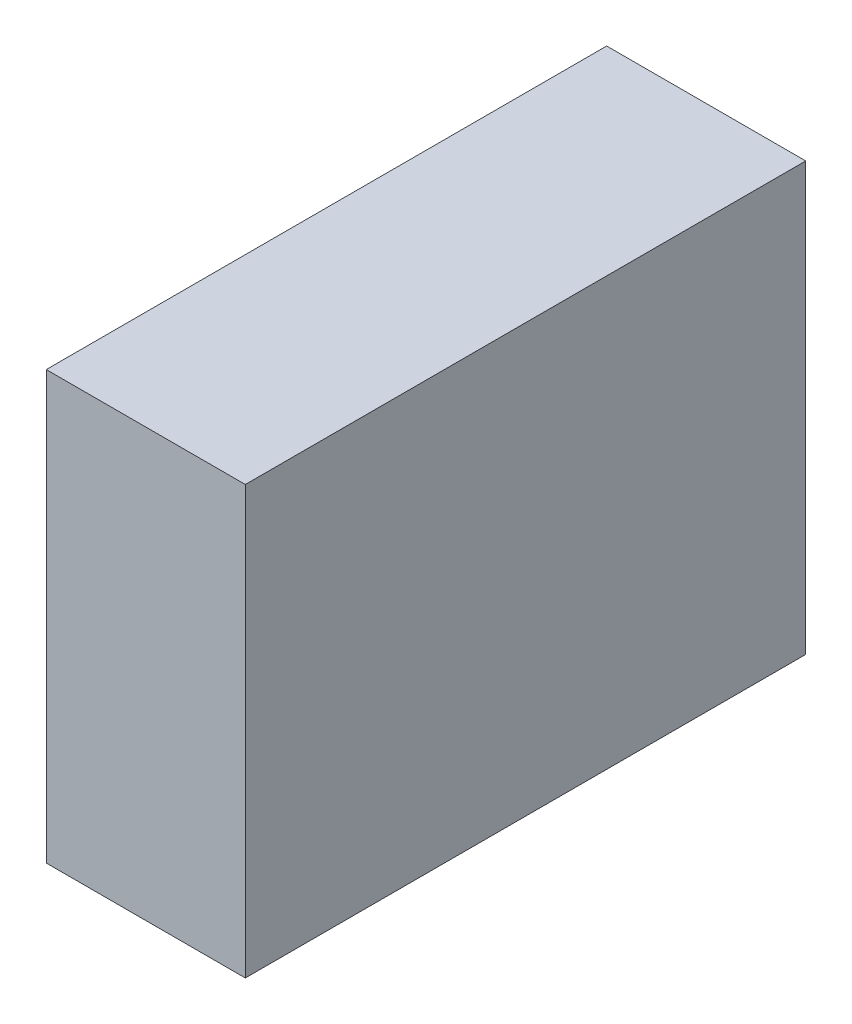
ISO-10303-21;
HEADER;
FILE_DESCRIPTION(('STEP AP214'),'2;1');
FILE_NAME('part.step','',(''),(''),'','','');
FILE_SCHEMA(('AUTOMOTIVE_DESIGN { 1 0 10303 214 1 1 1 1 }'));
ENDSEC;
DATA;
#1=APPLICATION_CONTEXT('core data for automotive mechanical design processes');
#2=APPLICATION_PROTOCOL_DEFINITION('international standard','automotive_design',2000,#1);
#3=PRODUCT_CONTEXT('',#1,'mechanical');
#4=PRODUCT('Part','Part','',(#3));
#5=PRODUCT_RELATED_PRODUCT_CATEGORY('part','',(#4));
#6=PRODUCT_DEFINITION_FORMATION('','',#4);
#7=PRODUCT_DEFINITION_CONTEXT('part definition',#1,'design');
#8=PRODUCT_DEFINITION('design','',#6,#7);
#9=PRODUCT_DEFINITION_SHAPE('','',#8);
#10=(LENGTH_UNIT() NAMED_UNIT(*) SI_UNIT(.MILLI.,.METRE.));
#11=(NAMED_UNIT(*) PLANE_ANGLE_UNIT() SI_UNIT($,.RADIAN.));
#12=(NAMED_UNIT(*) SI_UNIT($,.STERADIAN.) SOLID_ANGLE_UNIT());
#13=UNCERTAINTY_MEASURE_WITH_UNIT(LENGTH_MEASURE(1.E-05),#10,'distance_accuracy_value','');
#14=(GEOMETRIC_REPRESENTATION_CONTEXT(3) GLOBAL_UNCERTAINTY_ASSIGNED_CONTEXT((#13)) GLOBAL_UNIT_ASSIGNED_CONTEXT((#10,
#11,#12)) REPRESENTATION_CONTEXT('',''));
#15=CARTESIAN_POINT('',(0.,0.,0.));
#16=DIRECTION('',(0.,0.,1.));
#17=DIRECTION('',(1.,0.,0.));
#18=AXIS2_PLACEMENT_3D('',#15,#16,#17);
#19=CARTESIAN_POINT('',(26.797,115.062,75.438));
#20=DIRECTION('',(-1.,0.,0.));
#21=DIRECTION('',(0.,0.,1.));
#22=AXIS2_PLACEMENT_3D('',#19,#20,#21);
#23=PLANE('',#22);
#24=DIRECTION('',(0.,0.,-1.));
#25=VECTOR('',#24,1.);
#26=CARTESIAN_POINT('',(26.797,0.,75.438));
#27=LINE('',#26,#25);
#28=CARTESIAN_POINT('',(26.797,0.,75.438));
#29=VERTEX_POINT('',#28);
#30=CARTESIAN_POINT('',(26.797,0.,-75.438));
#31=VERTEX_POINT('',#30);
#32=EDGE_CURVE('E125',#29,#31,#27,.T.);
#33=ORIENTED_EDGE('',*,*,#32,.T.);
#34=DIRECTION('',(0.,-1.,0.));
#35=VECTOR('',#34,1.);
#36=CARTESIAN_POINT('',(26.797,115.062,-75.438));
#37=LINE('',#36,#35);
#38=CARTESIAN_POINT('',(26.797,115.062,-75.438));
#39=VERTEX_POINT('',#38);
#40=EDGE_CURVE('E11',#39,#31,#37,.T.);
#41=ORIENTED_EDGE('',*,*,#40,.F.);
#42=DIRECTION('',(0.,0.,-1.));
#43=VECTOR('',#42,1.);
#44=CARTESIAN_POINT('',(26.797,115.062,75.438));
#45=LINE('',#44,#43);
#46=CARTESIAN_POINT('',(26.797,115.062,75.438));
#47=VERTEX_POINT('',#46);
#48=EDGE_CURVE('E126',#47,#39,#45,.T.);
#49=ORIENTED_EDGE('',*,*,#48,.F.);
#50=DIRECTION('',(0.,-1.,0.));
#51=VECTOR('',#50,1.);
#52=CARTESIAN_POINT('',(26.797,115.062,75.438));
#53=LINE('',#52,#51);
#54=EDGE_CURVE('E132',#47,#29,#53,.T.);
#55=ORIENTED_EDGE('',*,*,#54,.T.);
#56=EDGE_LOOP('',(#33,#41,#49,#55));
#57=FACE_BOUND('',#56,.T.);
#58=ADVANCED_FACE('F32',(#57),#23,.F.);
#59=CARTESIAN_POINT('',(-26.797,115.062,-75.438));
#60=DIRECTION('',(0.,0.,1.));
#61=DIRECTION('',(1.,0.,0.));
#62=AXIS2_PLACEMENT_3D('',#59,#60,#61);
#63=PLANE('',#62);
#64=DIRECTION('',(-1.,0.,0.));
#65=VECTOR('',#64,1.);
#66=CARTESIAN_POINT('',(-26.797,0.,-75.438));
#67=LINE('',#66,#65);
#68=CARTESIAN_POINT('',(-26.797,0.,-75.438));
#69=VERTEX_POINT('',#68);
#70=EDGE_CURVE('E135',#31,#69,#67,.T.);
#71=ORIENTED_EDGE('',*,*,#70,.T.);
#72=DIRECTION('',(0.,-1.,0.));
#73=VECTOR('',#72,1.);
#74=CARTESIAN_POINT('',(-26.797,115.062,-75.438));
#75=LINE('',#74,#73);
#76=CARTESIAN_POINT('',(-26.797,115.062,-75.438));
#77=VERTEX_POINT('',#76);
#78=EDGE_CURVE('E40',#77,#69,#75,.T.);
#79=ORIENTED_EDGE('',*,*,#78,.F.);
#80=DIRECTION('',(-1.,0.,0.));
#81=VECTOR('',#80,1.);
#82=CARTESIAN_POINT('',(-26.797,115.062,-75.438));
#83=LINE('',#82,#81);
#84=EDGE_CURVE('E79',#39,#77,#83,.T.);
#85=ORIENTED_EDGE('',*,*,#84,.F.);
#86=ORIENTED_EDGE('',*,*,#40,.T.);
#87=EDGE_LOOP('',(#71,#79,#85,#86));
#88=FACE_BOUND('',#87,.T.);
#89=ADVANCED_FACE('F158',(#88),#63,.F.);
#90=CARTESIAN_POINT('',(-26.797,115.062,75.438));
#91=DIRECTION('',(1.,0.,0.));
#92=DIRECTION('',(0.,0.,-1.));
#93=AXIS2_PLACEMENT_3D('',#90,#91,#92);
#94=PLANE('',#93);
#95=DIRECTION('',(0.,0.,1.));
#96=VECTOR('',#95,1.);
#97=CARTESIAN_POINT('',(-26.797,0.,75.438));
#98=LINE('',#97,#96);
#99=CARTESIAN_POINT('',(-26.797,0.,75.438));
#100=VERTEX_POINT('',#99);
#101=EDGE_CURVE('E66',#69,#100,#98,.T.);
#102=ORIENTED_EDGE('',*,*,#101,.T.);
#103=DIRECTION('',(0.,-1.,0.));
#104=VECTOR('',#103,1.);
#105=CARTESIAN_POINT('',(-26.797,115.062,75.438));
#106=LINE('',#105,#104);
#107=CARTESIAN_POINT('',(-26.797,115.062,75.438));
#108=VERTEX_POINT('',#107);
#109=EDGE_CURVE('E140',#108,#100,#106,.T.);
#110=ORIENTED_EDGE('',*,*,#109,.F.);
#111=DIRECTION('',(0.,0.,1.));
#112=VECTOR('',#111,1.);
#113=CARTESIAN_POINT('',(-26.797,115.062,75.438));
#114=LINE('',#113,#112);
#115=EDGE_CURVE('E129',#77,#108,#114,.T.);
#116=ORIENTED_EDGE('',*,*,#115,.F.);
#117=ORIENTED_EDGE('',*,*,#78,.T.);
#118=EDGE_LOOP('',(#102,#110,#116,#117));
#119=FACE_BOUND('',#118,.T.);
#120=ADVANCED_FACE('F142',(#119),#94,.F.);
#121=CARTESIAN_POINT('',(-26.797,115.062,75.438));
#122=DIRECTION('',(0.,0.,-1.));
#123=DIRECTION('',(-1.,0.,0.));
#124=AXIS2_PLACEMENT_3D('',#121,#122,#123);
#125=PLANE('',#124);
#126=DIRECTION('',(1.,0.,0.));
#127=VECTOR('',#126,1.);
#128=CARTESIAN_POINT('',(-26.797,0.,75.438));
#129=LINE('',#128,#127);
#130=EDGE_CURVE('E72',#100,#29,#129,.T.);
#131=ORIENTED_EDGE('',*,*,#130,.T.);
#132=ORIENTED_EDGE('',*,*,#54,.F.);
#133=DIRECTION('',(1.,0.,0.));
#134=VECTOR('',#133,1.);
#135=CARTESIAN_POINT('',(-26.797,115.062,75.438));
#136=LINE('',#135,#134);
#137=EDGE_CURVE('E48',#108,#47,#136,.T.);
#138=ORIENTED_EDGE('',*,*,#137,.F.);
#139=ORIENTED_EDGE('',*,*,#109,.T.);
#140=EDGE_LOOP('',(#131,#132,#138,#139));
#141=FACE_BOUND('',#140,.T.);
#142=ADVANCED_FACE('F149',(#141),#125,.F.);
#143=CARTESIAN_POINT('',(26.797,115.062,-75.438));
#144=DIRECTION('',(0.,-1.,0.));
#145=DIRECTION('',(0.,0.,-1.));
#146=AXIS2_PLACEMENT_3D('',#143,#144,#145);
#147=PLANE('',#146);
#148=ORIENTED_EDGE('',*,*,#48,.T.);
#149=ORIENTED_EDGE('',*,*,#84,.T.);
#150=ORIENTED_EDGE('',*,*,#115,.T.);
#151=ORIENTED_EDGE('',*,*,#137,.T.);
#152=EDGE_LOOP('',(#148,#149,#150,#151));
#153=FACE_BOUND('',#152,.T.);
#154=ADVANCED_FACE('F151',(#153),#147,.F.);
#155=CARTESIAN_POINT('',(26.797,0.,-75.438));
#156=DIRECTION('',(0.,-1.,0.));
#157=DIRECTION('',(0.,0.,-1.));
#158=AXIS2_PLACEMENT_3D('',#155,#156,#157);
#159=PLANE('',#158);
#160=CARTESIAN_POINT('',(18.034,0.,69.977));
#161=DIRECTION('',(0.,-1.,0.));
#162=DIRECTION('',(0.,0.,-1.));
#163=AXIS2_PLACEMENT_3D('',#160,#161,#162);
#164=CIRCLE('',#163,2.15265);
#165=CARTESIAN_POINT('',(18.034,0.,67.82435));
#166=VERTEX_POINT('',#165);
#167=EDGE_CURVE('E103',#166,#166,#164,.T.);
#168=ORIENTED_EDGE('',*,*,#167,.F.);
#169=EDGE_LOOP('',(#168));
#170=FACE_BOUND('',#169,.T.);
#171=CARTESIAN_POINT('',(-18.034,0.,69.977));
#172=DIRECTION('',(0.,-1.,0.));
#173=DIRECTION('',(0.,0.,-1.));
#174=AXIS2_PLACEMENT_3D('',#171,#172,#173);
#175=CIRCLE('',#174,2.15265);
#176=CARTESIAN_POINT('',(-18.034,0.,67.82435));
#177=VERTEX_POINT('',#176);
#178=EDGE_CURVE('E102',#177,#177,#175,.T.);
#179=ORIENTED_EDGE('',*,*,#178,.F.);
#180=EDGE_LOOP('',(#179));
#181=FACE_BOUND('',#180,.T.);
#182=CARTESIAN_POINT('',(-18.034,0.,-69.977));
#183=DIRECTION('',(0.,-1.,0.));
#184=DIRECTION('',(0.,0.,-1.));
#185=AXIS2_PLACEMENT_3D('',#182,#183,#184);
#186=CIRCLE('',#185,2.15265);
#187=CARTESIAN_POINT('',(-18.034,0.,-72.12965));
#188=VERTEX_POINT('',#187);
#189=EDGE_CURVE('E113',#188,#188,#186,.T.);
#190=ORIENTED_EDGE('',*,*,#189,.F.);
#191=EDGE_LOOP('',(#190));
#192=FACE_BOUND('',#191,.T.);
#193=CARTESIAN_POINT('',(18.034,0.,-69.977));
#194=DIRECTION('',(0.,-1.,0.));
#195=DIRECTION('',(0.,0.,-1.));
#196=AXIS2_PLACEMENT_3D('',#193,#194,#195);
#197=CIRCLE('',#196,2.15265);
#198=CARTESIAN_POINT('',(18.034,0.,-72.12965));
#199=VERTEX_POINT('',#198);
#200=EDGE_CURVE('E119',#199,#199,#197,.T.);
#201=ORIENTED_EDGE('',*,*,#200,.F.);
#202=EDGE_LOOP('',(#201));
#203=FACE_BOUND('',#202,.T.);
#204=ORIENTED_EDGE('',*,*,#32,.F.);
#205=ORIENTED_EDGE('',*,*,#130,.F.);
#206=ORIENTED_EDGE('',*,*,#101,.F.);
#207=ORIENTED_EDGE('',*,*,#70,.F.);
#208=EDGE_LOOP('',(#204,#205,#206,#207));
#209=FACE_BOUND('',#208,.T.);
#210=ADVANCED_FACE('F145',(#170,#181,#192,#203,#209),#159,.T.);
#211=CARTESIAN_POINT('',(18.034,9.144,-69.977));
#212=DIRECTION('',(0.,-1.,0.));
#213=DIRECTION('',(0.,0.,-1.));
#214=AXIS2_PLACEMENT_3D('',#211,#212,#213);
#215=CONICAL_SURFACE('',#214,2.15265,1.02974425867665);
#216=CARTESIAN_POINT('',(18.034,10.4374426115497,-69.977));
#217=VERTEX_POINT('',#216);
#218=VERTEX_LOOP('',#217);
#219=FACE_BOUND('',#218,.T.);
#220=CARTESIAN_POINT('',(18.034,9.144,-69.977));
#221=DIRECTION('',(0.,-1.,0.));
#222=DIRECTION('',(0.,0.,-1.));
#223=AXIS2_PLACEMENT_3D('',#220,#221,#222);
#224=CIRCLE('',#223,2.15265);
#225=CARTESIAN_POINT('',(18.034,9.144,-72.12965));
#226=VERTEX_POINT('',#225);
#227=EDGE_CURVE('E122',#226,#226,#224,.T.);
#228=ORIENTED_EDGE('',*,*,#227,.T.);
#229=EDGE_LOOP('',(#228));
#230=FACE_BOUND('',#229,.T.);
#231=ADVANCED_FACE('F190',(#219,#230),#215,.F.);
#232=CARTESIAN_POINT('',(18.034,0.,-69.977));
#233=DIRECTION('',(0.,-1.,0.));
#234=DIRECTION('',(0.,0.,-1.));
#235=AXIS2_PLACEMENT_3D('',#232,#233,#234);
#236=CYLINDRICAL_SURFACE('',#235,2.15265);
#237=ORIENTED_EDGE('',*,*,#227,.F.);
#238=EDGE_LOOP('',(#237));
#239=FACE_BOUND('',#238,.T.);
#240=ORIENTED_EDGE('',*,*,#200,.T.);
#241=EDGE_LOOP('',(#240));
#242=FACE_BOUND('',#241,.T.);
#243=ADVANCED_FACE('F199',(#239,#242),#236,.F.);
#244=CARTESIAN_POINT('',(-18.034,9.144,-69.977));
#245=DIRECTION('',(0.,-1.,0.));
#246=DIRECTION('',(0.,0.,-1.));
#247=AXIS2_PLACEMENT_3D('',#244,#245,#246);
#248=CONICAL_SURFACE('',#247,2.15265,1.02974425867665);
#249=CARTESIAN_POINT('',(-18.034,10.4374426115497,-69.977));
#250=VERTEX_POINT('',#249);
#251=VERTEX_LOOP('',#250);
#252=FACE_BOUND('',#251,.T.);
#253=CARTESIAN_POINT('',(-18.034,9.144,-69.977));
#254=DIRECTION('',(0.,-1.,0.));
#255=DIRECTION('',(0.,0.,-1.));
#256=AXIS2_PLACEMENT_3D('',#253,#254,#255);
#257=CIRCLE('',#256,2.15265);
#258=CARTESIAN_POINT('',(-18.034,9.144,-72.12965));
#259=VERTEX_POINT('',#258);
#260=EDGE_CURVE('E116',#259,#259,#257,.T.);
#261=ORIENTED_EDGE('',*,*,#260,.T.);
#262=EDGE_LOOP('',(#261));
#263=FACE_BOUND('',#262,.T.);
#264=ADVANCED_FACE('F209',(#252,#263),#248,.F.);
#265=CARTESIAN_POINT('',(-18.034,0.,-69.977));
#266=DIRECTION('',(0.,-1.,0.));
#267=DIRECTION('',(0.,0.,-1.));
#268=AXIS2_PLACEMENT_3D('',#265,#266,#267);
#269=CYLINDRICAL_SURFACE('',#268,2.15265);
#270=ORIENTED_EDGE('',*,*,#260,.F.);
#271=EDGE_LOOP('',(#270));
#272=FACE_BOUND('',#271,.T.);
#273=ORIENTED_EDGE('',*,*,#189,.T.);
#274=EDGE_LOOP('',(#273));
#275=FACE_BOUND('',#274,.T.);
#276=ADVANCED_FACE('F219',(#272,#275),#269,.F.);
#277=CARTESIAN_POINT('',(-18.034,9.144,69.977));
#278=DIRECTION('',(0.,-1.,0.));
#279=DIRECTION('',(0.,0.,-1.));
#280=AXIS2_PLACEMENT_3D('',#277,#278,#279);
#281=CONICAL_SURFACE('',#280,2.15265,1.02974425867665);
#282=CARTESIAN_POINT('',(-18.034,10.4374426115497,69.977));
#283=VERTEX_POINT('',#282);
#284=VERTEX_LOOP('',#283);
#285=FACE_BOUND('',#284,.T.);
#286=CARTESIAN_POINT('',(-18.034,9.144,69.977));
#287=DIRECTION('',(0.,-1.,0.));
#288=DIRECTION('',(0.,0.,-1.));
#289=AXIS2_PLACEMENT_3D('',#286,#287,#288);
#290=CIRCLE('',#289,2.15265);
#291=CARTESIAN_POINT('',(-18.034,9.144,67.82435));
#292=VERTEX_POINT('',#291);
#293=EDGE_CURVE('E106',#292,#292,#290,.T.);
#294=ORIENTED_EDGE('',*,*,#293,.T.);
#295=EDGE_LOOP('',(#294));
#296=FACE_BOUND('',#295,.T.);
#297=ADVANCED_FACE('F229',(#285,#296),#281,.F.);
#298=CARTESIAN_POINT('',(-18.034,0.,69.977));
#299=DIRECTION('',(0.,-1.,0.));
#300=DIRECTION('',(0.,0.,-1.));
#301=AXIS2_PLACEMENT_3D('',#298,#299,#300);
#302=CYLINDRICAL_SURFACE('',#301,2.15265);
#303=ORIENTED_EDGE('',*,*,#293,.F.);
#304=EDGE_LOOP('',(#303));
#305=FACE_BOUND('',#304,.T.);
#306=ORIENTED_EDGE('',*,*,#178,.T.);
#307=EDGE_LOOP('',(#306));
#308=FACE_BOUND('',#307,.T.);
#309=ADVANCED_FACE('F96',(#305,#308),#302,.F.);
#310=CARTESIAN_POINT('',(18.034,9.144,69.977));
#311=DIRECTION('',(0.,-1.,0.));
#312=DIRECTION('',(0.,0.,-1.));
#313=AXIS2_PLACEMENT_3D('',#310,#311,#312);
#314=CONICAL_SURFACE('',#313,2.15265,1.02974425867665);
#315=CARTESIAN_POINT('',(18.034,10.4374426115497,69.977));
#316=VERTEX_POINT('',#315);
#317=VERTEX_LOOP('',#316);
#318=FACE_BOUND('',#317,.T.);
#319=CARTESIAN_POINT('',(18.034,9.144,69.977));
#320=DIRECTION('',(0.,-1.,0.));
#321=DIRECTION('',(0.,0.,-1.));
#322=AXIS2_PLACEMENT_3D('',#319,#320,#321);
#323=CIRCLE('',#322,2.15265);
#324=CARTESIAN_POINT('',(18.034,9.144,67.82435));
#325=VERTEX_POINT('',#324);
#326=EDGE_CURVE('E100',#325,#325,#323,.T.);
#327=ORIENTED_EDGE('',*,*,#326,.T.);
#328=EDGE_LOOP('',(#327));
#329=FACE_BOUND('',#328,.T.);
#330=ADVANCED_FACE('F92',(#318,#329),#314,.F.);
#331=CARTESIAN_POINT('',(18.034,0.,69.977));
#332=DIRECTION('',(0.,-1.,0.));
#333=DIRECTION('',(0.,0.,-1.));
#334=AXIS2_PLACEMENT_3D('',#331,#332,#333);
#335=CYLINDRICAL_SURFACE('',#334,2.15265);
#336=ORIENTED_EDGE('',*,*,#326,.F.);
#337=EDGE_LOOP('',(#336));
#338=FACE_BOUND('',#337,.T.);
#339=ORIENTED_EDGE('',*,*,#167,.T.);
#340=EDGE_LOOP('',(#339));
#341=FACE_BOUND('',#340,.T.);
#342=ADVANCED_FACE('F95',(#338,#341),#335,.F.);
#343=CLOSED_SHELL('',(#58,#89,#120,#142,#154,#210,#231,#243,#264,#276,#297,#309,#330,#342));
#344=MANIFOLD_SOLID_BREP('B2',#343);
#345=ADVANCED_BREP_SHAPE_REPRESENTATION('',(#18,#344),#14);
#346=SHAPE_DEFINITION_REPRESENTATION(#9,#345);
ENDSEC;
END-ISO-10303-21;
